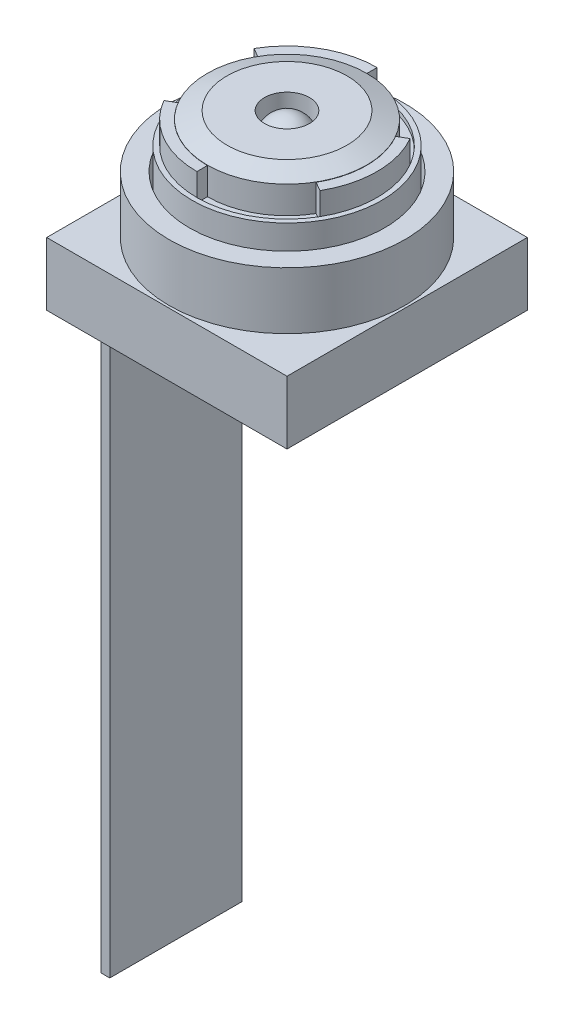
ISO-10303-21;
HEADER;
FILE_DESCRIPTION(('STEP AP214'),'2;1');
FILE_NAME('part.step','',(''),(''),'','','');
FILE_SCHEMA(('AUTOMOTIVE_DESIGN { 1 0 10303 214 1 1 1 1 }'));
ENDSEC;
DATA;
#1=APPLICATION_CONTEXT('core data for automotive mechanical design processes');
#2=APPLICATION_PROTOCOL_DEFINITION('international standard','automotive_design',2000,#1);
#3=PRODUCT_CONTEXT('',#1,'mechanical');
#4=PRODUCT('Part','Part','',(#3));
#5=PRODUCT_RELATED_PRODUCT_CATEGORY('part','',(#4));
#6=PRODUCT_DEFINITION_FORMATION('','',#4);
#7=PRODUCT_DEFINITION_CONTEXT('part definition',#1,'design');
#8=PRODUCT_DEFINITION('design','',#6,#7);
#9=PRODUCT_DEFINITION_SHAPE('','',#8);
#10=(LENGTH_UNIT() NAMED_UNIT(*) SI_UNIT(.MILLI.,.METRE.));
#11=(NAMED_UNIT(*) PLANE_ANGLE_UNIT() SI_UNIT($,.RADIAN.));
#12=(NAMED_UNIT(*) SI_UNIT($,.STERADIAN.) SOLID_ANGLE_UNIT());
#13=UNCERTAINTY_MEASURE_WITH_UNIT(LENGTH_MEASURE(1.E-05),#10,'distance_accuracy_value','');
#14=(GEOMETRIC_REPRESENTATION_CONTEXT(3) GLOBAL_UNCERTAINTY_ASSIGNED_CONTEXT((#13)) GLOBAL_UNIT_ASSIGNED_CONTEXT((#10,
#11,#12)) REPRESENTATION_CONTEXT('',''));
#15=CARTESIAN_POINT('',(0.,0.,0.));
#16=DIRECTION('',(0.,0.,1.));
#17=DIRECTION('',(1.,0.,0.));
#18=AXIS2_PLACEMENT_3D('',#15,#16,#17);
#19=CARTESIAN_POINT('',(18.,2.1,6.25));
#20=DIRECTION('',(0.,1.,0.));
#21=DIRECTION('',(0.,0.,1.));
#22=AXIS2_PLACEMENT_3D('',#19,#20,#21);
#23=PLANE('',#22);
#24=CARTESIAN_POINT('',(18.,2.1,6.25));
#25=DIRECTION('',(0.,1.,0.));
#26=DIRECTION('',(0.,0.,1.));
#27=AXIS2_PLACEMENT_3D('',#24,#25,#26);
#28=CIRCLE('',#27,0.750000000000001);
#29=CARTESIAN_POINT('',(18.,2.1,7.));
#30=VERTEX_POINT('',#29);
#31=EDGE_CURVE('P0_E20',#30,#30,#28,.T.);
#32=ORIENTED_EDGE('',*,*,#31,.T.);
#33=EDGE_LOOP('',(#32));
#34=FACE_BOUND('',#33,.T.);
#35=ADVANCED_FACE('P0_F17',(#34),#23,.T.);
#36=CARTESIAN_POINT('',(18.,0.,6.25));
#37=DIRECTION('',(0.,1.,0.));
#38=DIRECTION('',(0.,0.,1.));
#39=AXIS2_PLACEMENT_3D('',#36,#37,#38);
#40=CYLINDRICAL_SURFACE('',#39,0.750000000000001);
#41=ORIENTED_EDGE('',*,*,#31,.F.);
#42=EDGE_LOOP('',(#41));
#43=FACE_BOUND('',#42,.T.);
#44=CARTESIAN_POINT('',(18.,5.76,6.25));
#45=DIRECTION('',(0.,1.,0.));
#46=DIRECTION('',(0.,0.,1.));
#47=AXIS2_PLACEMENT_3D('',#44,#45,#46);
#48=CIRCLE('',#47,0.750000000000001);
#49=CARTESIAN_POINT('',(18.,5.76,7.));
#50=VERTEX_POINT('',#49);
#51=EDGE_CURVE('P0_E270',#50,#50,#48,.F.);
#52=ORIENTED_EDGE('',*,*,#51,.F.);
#53=EDGE_LOOP('',(#52));
#54=FACE_BOUND('',#53,.T.);
#55=ADVANCED_FACE('P0_F278',(#43,#54),#40,.F.);
#56=CARTESIAN_POINT('',(18.,5.76,6.25));
#57=DIRECTION('',(0.,1.,0.));
#58=DIRECTION('',(0.,0.,1.));
#59=AXIS2_PLACEMENT_3D('',#56,#57,#58);
#60=PLANE('',#59);
#61=ORIENTED_EDGE('',*,*,#51,.T.);
#62=EDGE_LOOP('',(#61));
#63=FACE_BOUND('',#62,.T.);
#64=CARTESIAN_POINT('',(18.,5.76000000002243,6.25));
#65=DIRECTION('',(0.,-1.,0.));
#66=DIRECTION('',(0.,0.,-1.));
#67=AXIS2_PLACEMENT_3D('',#64,#65,#66);
#68=CIRCLE('',#67,1.99999999998181);
#69=CARTESIAN_POINT('',(18.,5.76000000002243,4.25000000001819));
#70=VERTEX_POINT('',#69);
#71=EDGE_CURVE('P0_E190',#70,#70,#68,.T.);
#72=ORIENTED_EDGE('',*,*,#71,.F.);
#73=EDGE_LOOP('',(#72));
#74=FACE_BOUND('',#73,.T.);
#75=ADVANCED_FACE('P0_F281',(#63,#74),#60,.T.);
#76=CARTESIAN_POINT('',(18.,5.51000000004365,6.25));
#77=DIRECTION('',(0.,-1.,0.));
#78=DIRECTION('',(0.,0.,-1.));
#79=AXIS2_PLACEMENT_3D('',#76,#77,#78);
#80=CONICAL_SURFACE('',#79,2.64999999993233,1.20362249297961);
#81=CARTESIAN_POINT('',(18.,5.51,6.25));
#82=DIRECTION('',(0.,1.,0.));
#83=DIRECTION('',(0.,0.,1.));
#84=AXIS2_PLACEMENT_3D('',#81,#82,#83);
#85=CIRCLE('',#84,2.65);
#86=CARTESIAN_POINT('',(18.,5.51,8.9));
#87=VERTEX_POINT('',#86);
#88=EDGE_CURVE('P0_E156',#87,#87,#85,.F.);
#89=ORIENTED_EDGE('',*,*,#88,.F.);
#90=EDGE_LOOP('',(#89));
#91=FACE_BOUND('',#90,.T.);
#92=ORIENTED_EDGE('',*,*,#71,.T.);
#93=EDGE_LOOP('',(#92));
#94=FACE_BOUND('',#93,.T.);
#95=ADVANCED_FACE('P0_F287',(#91,#94),#80,.T.);
#96=CARTESIAN_POINT('',(18.,0.,6.25));
#97=DIRECTION('',(0.,1.,0.));
#98=DIRECTION('',(0.,0.,1.));
#99=AXIS2_PLACEMENT_3D('',#96,#97,#98);
#100=CYLINDRICAL_SURFACE('',#99,2.65);
#101=CARTESIAN_POINT('',(18.,4.6,6.25));
#102=DIRECTION('',(0.,1.,0.));
#103=DIRECTION('',(0.,0.,1.));
#104=AXIS2_PLACEMENT_3D('',#101,#102,#103);
#105=CIRCLE('',#104,2.65);
#106=CARTESIAN_POINT('',(15.7050326799712,4.6,7.57499999999998));
#107=VERTEX_POINT('',#106);
#108=CARTESIAN_POINT('',(15.7050326799712,4.6,4.92499999999999));
#109=VERTEX_POINT('',#108);
#110=EDGE_CURVE('P0_E143',#107,#109,#105,.F.);
#111=ORIENTED_EDGE('',*,*,#110,.F.);
#112=DIRECTION('',(0.,1.,0.));
#113=VECTOR('',#112,1.);
#114=CARTESIAN_POINT('',(15.7050326799712,0.,7.57499999999998));
#115=LINE('',#114,#113);
#116=CARTESIAN_POINT('',(15.7050326799712,5.5,7.57499999999998));
#117=VERTEX_POINT('',#116);
#118=EDGE_CURVE('P0_E148',#107,#117,#115,.T.);
#119=ORIENTED_EDGE('',*,*,#118,.T.);
#120=CARTESIAN_POINT('',(18.,5.5,6.25));
#121=DIRECTION('',(0.,1.,0.));
#122=DIRECTION('',(0.,0.,1.));
#123=AXIS2_PLACEMENT_3D('',#120,#121,#122);
#124=CIRCLE('',#123,2.65);
#125=CARTESIAN_POINT('',(18.,5.5,8.9));
#126=VERTEX_POINT('',#125);
#127=EDGE_CURVE('P0_E173',#126,#117,#124,.F.);
#128=ORIENTED_EDGE('',*,*,#127,.F.);
#129=DIRECTION('',(0.,1.,0.));
#130=VECTOR('',#129,1.);
#131=CARTESIAN_POINT('',(18.,0.,8.9));
#132=LINE('',#131,#130);
#133=CARTESIAN_POINT('',(18.,4.6,8.9));
#134=VERTEX_POINT('',#133);
#135=EDGE_CURVE('P0_E182',#134,#126,#132,.T.);
#136=ORIENTED_EDGE('',*,*,#135,.F.);
#137=CARTESIAN_POINT('',(18.,4.6,6.25));
#138=DIRECTION('',(0.,1.,0.));
#139=DIRECTION('',(0.,0.,1.));
#140=AXIS2_PLACEMENT_3D('',#137,#138,#139);
#141=CIRCLE('',#140,2.65);
#142=CARTESIAN_POINT('',(20.2949673200288,4.6,7.57499999999999));
#143=VERTEX_POINT('',#142);
#144=EDGE_CURVE('P0_E258',#143,#134,#141,.F.);
#145=ORIENTED_EDGE('',*,*,#144,.F.);
#146=DIRECTION('',(0.,1.,0.));
#147=VECTOR('',#146,1.);
#148=CARTESIAN_POINT('',(20.2949673200288,0.,7.575));
#149=LINE('',#148,#147);
#150=CARTESIAN_POINT('',(20.2949673200288,5.5,7.57499999999999));
#151=VERTEX_POINT('',#150);
#152=EDGE_CURVE('P0_E185',#151,#143,#149,.F.);
#153=ORIENTED_EDGE('',*,*,#152,.F.);
#154=CARTESIAN_POINT('',(18.,5.5,6.25));
#155=DIRECTION('',(0.,1.,0.));
#156=DIRECTION('',(0.,0.,1.));
#157=AXIS2_PLACEMENT_3D('',#154,#155,#156);
#158=CIRCLE('',#157,2.65);
#159=CARTESIAN_POINT('',(20.2949673200288,5.5,4.92500000000001));
#160=VERTEX_POINT('',#159);
#161=EDGE_CURVE('P0_E260',#160,#151,#158,.F.);
#162=ORIENTED_EDGE('',*,*,#161,.F.);
#163=DIRECTION('',(0.,1.,0.));
#164=VECTOR('',#163,1.);
#165=CARTESIAN_POINT('',(20.2949673200288,0.,4.92500000000001));
#166=LINE('',#165,#164);
#167=CARTESIAN_POINT('',(20.2949673200288,4.6,4.925));
#168=VERTEX_POINT('',#167);
#169=EDGE_CURVE('P0_E168',#160,#168,#166,.F.);
#170=ORIENTED_EDGE('',*,*,#169,.T.);
#171=CARTESIAN_POINT('',(18.,4.6,6.25));
#172=DIRECTION('',(0.,1.,0.));
#173=DIRECTION('',(0.,0.,1.));
#174=AXIS2_PLACEMENT_3D('',#171,#172,#173);
#175=CIRCLE('',#174,2.65);
#176=CARTESIAN_POINT('',(18.,4.6,3.6));
#177=VERTEX_POINT('',#176);
#178=EDGE_CURVE('P0_E263',#177,#168,#175,.F.);
#179=ORIENTED_EDGE('',*,*,#178,.F.);
#180=DIRECTION('',(0.,1.,0.));
#181=VECTOR('',#180,1.);
#182=CARTESIAN_POINT('',(18.,0.,3.6));
#183=LINE('',#182,#181);
#184=CARTESIAN_POINT('',(18.,5.5,3.6));
#185=VERTEX_POINT('',#184);
#186=EDGE_CURVE('P0_E191',#185,#177,#183,.F.);
#187=ORIENTED_EDGE('',*,*,#186,.F.);
#188=CARTESIAN_POINT('',(18.,5.5,6.25));
#189=DIRECTION('',(0.,1.,0.));
#190=DIRECTION('',(0.,0.,1.));
#191=AXIS2_PLACEMENT_3D('',#188,#189,#190);
#192=CIRCLE('',#191,2.65);
#193=CARTESIAN_POINT('',(15.7050326799712,5.5,4.925));
#194=VERTEX_POINT('',#193);
#195=EDGE_CURVE('P0_E267',#194,#185,#192,.F.);
#196=ORIENTED_EDGE('',*,*,#195,.F.);
#197=DIRECTION('',(0.,1.,0.));
#198=VECTOR('',#197,1.);
#199=CARTESIAN_POINT('',(15.7050326799712,0.,4.92499999999998));
#200=LINE('',#199,#198);
#201=EDGE_CURVE('P0_E151',#109,#194,#200,.T.);
#202=ORIENTED_EDGE('',*,*,#201,.F.);
#203=EDGE_LOOP('',(#111,#119,#128,#136,#145,#153,#162,#170,#179,#187,#196,#202));
#204=FACE_BOUND('',#203,.T.);
#205=ORIENTED_EDGE('',*,*,#88,.T.);
#206=EDGE_LOOP('',(#205));
#207=FACE_BOUND('',#206,.T.);
#208=ADVANCED_FACE('P0_F145',(#204,#207),#100,.T.);
#209=CARTESIAN_POINT('',(15.3525163399856,4.6,6.25));
#210=DIRECTION('',(0.,1.,0.));
#211=DIRECTION('',(0.,0.,1.));
#212=AXIS2_PLACEMENT_3D('',#209,#210,#211);
#213=PLANE('',#212);
#214=DIRECTION('',(-0.866025403784439,0.,0.5));
#215=VECTOR('',#214,1.);
#216=CARTESIAN_POINT('',(15.7050326799712,4.6,7.575));
#217=LINE('',#216,#215);
#218=CARTESIAN_POINT('',(15.4019237886467,4.6,7.74999999999999));
#219=VERTEX_POINT('',#218);
#220=EDGE_CURVE('P0_E163',#107,#219,#217,.T.);
#221=ORIENTED_EDGE('',*,*,#220,.F.);
#222=ORIENTED_EDGE('',*,*,#110,.T.);
#223=DIRECTION('',(0.866025403784439,0.,0.5));
#224=VECTOR('',#223,1.);
#225=CARTESIAN_POINT('',(15.4019237886467,4.6,4.75));
#226=LINE('',#225,#224);
#227=CARTESIAN_POINT('',(15.4019237886467,4.6,4.74999999999999));
#228=VERTEX_POINT('',#227);
#229=EDGE_CURVE('P0_E155',#228,#109,#226,.T.);
#230=ORIENTED_EDGE('',*,*,#229,.F.);
#231=CARTESIAN_POINT('',(18.,4.6,6.25));
#232=DIRECTION('',(0.,1.,0.));
#233=DIRECTION('',(0.,0.,1.));
#234=AXIS2_PLACEMENT_3D('',#231,#232,#233);
#235=CIRCLE('',#234,3.);
#236=EDGE_CURVE('P0_E172',#228,#219,#235,.T.);
#237=ORIENTED_EDGE('',*,*,#236,.T.);
#238=EDGE_LOOP('',(#221,#222,#230,#237));
#239=FACE_BOUND('',#238,.T.);
#240=ADVANCED_FACE('P0_F170',(#239),#213,.T.);
#241=CARTESIAN_POINT('',(15.4019237886467,0.,4.75));
#242=DIRECTION('',(-0.5,0.,0.866025403784439));
#243=DIRECTION('',(0.866025403784439,0.,0.5));
#244=AXIS2_PLACEMENT_3D('',#241,#242,#243);
#245=PLANE('',#244);
#246=DIRECTION('',(0.,1.,0.));
#247=VECTOR('',#246,1.);
#248=CARTESIAN_POINT('',(15.4019237886467,0.,4.74999999999999));
#249=LINE('',#248,#247);
#250=CARTESIAN_POINT('',(15.4019237886467,4.75,4.74999999999999));
#251=VERTEX_POINT('',#250);
#252=CARTESIAN_POINT('',(15.4019237886467,5.5,4.74999999999999));
#253=VERTEX_POINT('',#252);
#254=EDGE_CURVE('P0_E255',#251,#253,#249,.T.);
#255=ORIENTED_EDGE('',*,*,#254,.F.);
#256=DIRECTION('',(0.,1.,0.));
#257=VECTOR('',#256,1.);
#258=CARTESIAN_POINT('',(15.4019237886467,0.,4.74999999999999));
#259=LINE('',#258,#257);
#260=EDGE_CURVE('P0_E256',#251,#228,#259,.F.);
#261=ORIENTED_EDGE('',*,*,#260,.T.);
#262=ORIENTED_EDGE('',*,*,#229,.T.);
#263=ORIENTED_EDGE('',*,*,#201,.T.);
#264=DIRECTION('',(0.866025403784402,0.,0.500000000000063));
#265=VECTOR('',#264,1.);
#266=CARTESIAN_POINT('',(15.4019237886467,5.5,4.75));
#267=LINE('',#266,#265);
#268=EDGE_CURVE('P0_E196',#253,#194,#267,.T.);
#269=ORIENTED_EDGE('',*,*,#268,.F.);
#270=EDGE_LOOP('',(#255,#261,#262,#263,#269));
#271=FACE_BOUND('',#270,.T.);
#272=ADVANCED_FACE('P0_F401',(#271),#245,.T.);
#273=CARTESIAN_POINT('',(16.7009618943233,5.5,4.0875));
#274=DIRECTION('',(0.,1.,0.));
#275=DIRECTION('',(0.,0.,1.));
#276=AXIS2_PLACEMENT_3D('',#273,#274,#275);
#277=PLANE('',#276);
#278=ORIENTED_EDGE('',*,*,#195,.T.);
#279=DIRECTION('',(0.,0.,-1.));
#280=VECTOR('',#279,1.);
#281=CARTESIAN_POINT('',(18.,5.5,3.6));
#282=LINE('',#281,#280);
#283=CARTESIAN_POINT('',(18.,5.5,3.25));
#284=VERTEX_POINT('',#283);
#285=EDGE_CURVE('P0_E194',#284,#185,#282,.F.);
#286=ORIENTED_EDGE('',*,*,#285,.F.);
#287=CARTESIAN_POINT('',(18.,5.5,6.25));
#288=DIRECTION('',(0.,1.,0.));
#289=DIRECTION('',(0.,0.,1.));
#290=AXIS2_PLACEMENT_3D('',#287,#288,#289);
#291=CIRCLE('',#290,3.);
#292=EDGE_CURVE('P0_E252',#253,#284,#291,.F.);
#293=ORIENTED_EDGE('',*,*,#292,.F.);
#294=ORIENTED_EDGE('',*,*,#268,.T.);
#295=EDGE_LOOP('',(#278,#286,#293,#294));
#296=FACE_BOUND('',#295,.T.);
#297=ADVANCED_FACE('P0_F397',(#296),#277,.T.);
#298=CARTESIAN_POINT('',(18.,0.,3.6));
#299=DIRECTION('',(1.,0.,0.));
#300=DIRECTION('',(0.,0.,-1.));
#301=AXIS2_PLACEMENT_3D('',#298,#299,#300);
#302=PLANE('',#301);
#303=ORIENTED_EDGE('',*,*,#285,.T.);
#304=ORIENTED_EDGE('',*,*,#186,.T.);
#305=DIRECTION('',(0.,0.,1.));
#306=VECTOR('',#305,1.);
#307=CARTESIAN_POINT('',(18.,4.6,4.0875));
#308=LINE('',#307,#306);
#309=CARTESIAN_POINT('',(18.,4.6,3.25));
#310=VERTEX_POINT('',#309);
#311=EDGE_CURVE('P0_E193',#310,#177,#308,.T.);
#312=ORIENTED_EDGE('',*,*,#311,.F.);
#313=DIRECTION('',(0.,1.,0.));
#314=VECTOR('',#313,1.);
#315=CARTESIAN_POINT('',(18.,0.,3.25));
#316=LINE('',#315,#314);
#317=CARTESIAN_POINT('',(18.,4.75,3.25));
#318=VERTEX_POINT('',#317);
#319=EDGE_CURVE('P0_E642',#310,#318,#316,.T.);
#320=ORIENTED_EDGE('',*,*,#319,.T.);
#321=DIRECTION('',(0.,1.,0.));
#322=VECTOR('',#321,1.);
#323=CARTESIAN_POINT('',(18.,0.,3.25));
#324=LINE('',#323,#322);
#325=EDGE_CURVE('P0_E254',#284,#318,#324,.F.);
#326=ORIENTED_EDGE('',*,*,#325,.F.);
#327=EDGE_LOOP('',(#303,#304,#312,#320,#326));
#328=FACE_BOUND('',#327,.T.);
#329=ADVANCED_FACE('P0_F393',(#328),#302,.T.);
#330=CARTESIAN_POINT('',(19.2990381056767,4.6,4.0875));
#331=DIRECTION('',(0.,1.,0.));
#332=DIRECTION('',(0.,0.,1.));
#333=AXIS2_PLACEMENT_3D('',#330,#331,#332);
#334=PLANE('',#333);
#335=ORIENTED_EDGE('',*,*,#311,.T.);
#336=ORIENTED_EDGE('',*,*,#178,.T.);
#337=DIRECTION('',(-0.866025403784439,0.,0.5));
#338=VECTOR('',#337,1.);
#339=CARTESIAN_POINT('',(20.5980762113533,4.6,4.75));
#340=LINE('',#339,#338);
#341=CARTESIAN_POINT('',(20.5980762113533,4.6,4.74999999999999));
#342=VERTEX_POINT('',#341);
#343=EDGE_CURVE('P0_E266',#342,#168,#340,.T.);
#344=ORIENTED_EDGE('',*,*,#343,.F.);
#345=CARTESIAN_POINT('',(18.,4.6,6.25));
#346=DIRECTION('',(0.,1.,0.));
#347=DIRECTION('',(0.,0.,1.));
#348=AXIS2_PLACEMENT_3D('',#345,#346,#347);
#349=CIRCLE('',#348,3.);
#350=EDGE_CURVE('P0_E248',#342,#310,#349,.T.);
#351=ORIENTED_EDGE('',*,*,#350,.T.);
#352=EDGE_LOOP('',(#335,#336,#344,#351));
#353=FACE_BOUND('',#352,.T.);
#354=ADVANCED_FACE('P0_F389',(#353),#334,.T.);
#355=CARTESIAN_POINT('',(20.5980762113533,0.,4.75));
#356=DIRECTION('',(-0.5,0.,-0.866025403784439));
#357=DIRECTION('',(-0.866025403784439,0.,0.5));
#358=AXIS2_PLACEMENT_3D('',#355,#356,#357);
#359=PLANE('',#358);
#360=DIRECTION('',(0.,1.,0.));
#361=VECTOR('',#360,1.);
#362=CARTESIAN_POINT('',(20.5980762113533,0.,4.74999999999999));
#363=LINE('',#362,#361);
#364=CARTESIAN_POINT('',(20.5980762113533,4.75,4.74999999999999));
#365=VERTEX_POINT('',#364);
#366=CARTESIAN_POINT('',(20.5980762113533,5.5,4.74999999999999));
#367=VERTEX_POINT('',#366);
#368=EDGE_CURVE('P0_E247',#365,#367,#363,.T.);
#369=ORIENTED_EDGE('',*,*,#368,.F.);
#370=DIRECTION('',(0.,1.,0.));
#371=VECTOR('',#370,1.);
#372=CARTESIAN_POINT('',(20.5980762113533,0.,4.74999999999999));
#373=LINE('',#372,#371);
#374=EDGE_CURVE('P0_E251',#365,#342,#373,.F.);
#375=ORIENTED_EDGE('',*,*,#374,.T.);
#376=ORIENTED_EDGE('',*,*,#343,.T.);
#377=ORIENTED_EDGE('',*,*,#169,.F.);
#378=DIRECTION('',(-0.866025403784401,0.,0.500000000000066));
#379=VECTOR('',#378,1.);
#380=CARTESIAN_POINT('',(20.5980762113533,5.5,4.75));
#381=LINE('',#380,#379);
#382=EDGE_CURVE('P0_E262',#367,#160,#381,.T.);
#383=ORIENTED_EDGE('',*,*,#382,.F.);
#384=EDGE_LOOP('',(#369,#375,#376,#377,#383));
#385=FACE_BOUND('',#384,.T.);
#386=ADVANCED_FACE('P0_F385',(#385),#359,.T.);
#387=CARTESIAN_POINT('',(20.6474836600144,5.5,6.25));
#388=DIRECTION('',(0.,1.,0.));
#389=DIRECTION('',(0.,0.,1.));
#390=AXIS2_PLACEMENT_3D('',#387,#388,#389);
#391=PLANE('',#390);
#392=ORIENTED_EDGE('',*,*,#161,.T.);
#393=DIRECTION('',(0.866025403784439,0.,0.5));
#394=VECTOR('',#393,1.);
#395=CARTESIAN_POINT('',(20.2949673200288,5.5,7.575));
#396=LINE('',#395,#394);
#397=CARTESIAN_POINT('',(20.5980762113533,5.5,7.75));
#398=VERTEX_POINT('',#397);
#399=EDGE_CURVE('P0_E188',#398,#151,#396,.F.);
#400=ORIENTED_EDGE('',*,*,#399,.F.);
#401=CARTESIAN_POINT('',(18.,5.5,6.25));
#402=DIRECTION('',(0.,1.,0.));
#403=DIRECTION('',(0.,0.,1.));
#404=AXIS2_PLACEMENT_3D('',#401,#402,#403);
#405=CIRCLE('',#404,3.);
#406=EDGE_CURVE('P0_E244',#367,#398,#405,.F.);
#407=ORIENTED_EDGE('',*,*,#406,.F.);
#408=ORIENTED_EDGE('',*,*,#382,.T.);
#409=EDGE_LOOP('',(#392,#400,#407,#408));
#410=FACE_BOUND('',#409,.T.);
#411=ADVANCED_FACE('P0_F381',(#410),#391,.T.);
#412=CARTESIAN_POINT('',(20.2949673200288,0.,7.575));
#413=DIRECTION('',(-0.5,0.,0.866025403784439));
#414=DIRECTION('',(0.866025403784439,0.,0.5));
#415=AXIS2_PLACEMENT_3D('',#412,#413,#414);
#416=PLANE('',#415);
#417=ORIENTED_EDGE('',*,*,#399,.T.);
#418=ORIENTED_EDGE('',*,*,#152,.T.);
#419=DIRECTION('',(-0.866025403784401,0.,-0.500000000000066));
#420=VECTOR('',#419,1.);
#421=CARTESIAN_POINT('',(20.5980762113533,4.6,7.75));
#422=LINE('',#421,#420);
#423=CARTESIAN_POINT('',(20.5980762113533,4.6,7.75000000000001));
#424=VERTEX_POINT('',#423);
#425=EDGE_CURVE('P0_E187',#424,#143,#422,.T.);
#426=ORIENTED_EDGE('',*,*,#425,.F.);
#427=DIRECTION('',(0.,1.,0.));
#428=VECTOR('',#427,1.);
#429=CARTESIAN_POINT('',(20.5980762113533,0.,7.75000000000001));
#430=LINE('',#429,#428);
#431=CARTESIAN_POINT('',(20.5980762113533,4.75,7.75000000000001));
#432=VERTEX_POINT('',#431);
#433=EDGE_CURVE('P0_E681',#424,#432,#430,.T.);
#434=ORIENTED_EDGE('',*,*,#433,.T.);
#435=DIRECTION('',(0.,1.,0.));
#436=VECTOR('',#435,1.);
#437=CARTESIAN_POINT('',(20.5980762113533,0.,7.75000000000001));
#438=LINE('',#437,#436);
#439=EDGE_CURVE('P0_E246',#398,#432,#438,.F.);
#440=ORIENTED_EDGE('',*,*,#439,.F.);
#441=EDGE_LOOP('',(#417,#418,#426,#434,#440));
#442=FACE_BOUND('',#441,.T.);
#443=ADVANCED_FACE('P0_F377',(#442),#416,.T.);
#444=CARTESIAN_POINT('',(19.2990381056767,4.6,8.4125));
#445=DIRECTION('',(0.,1.,0.));
#446=DIRECTION('',(0.,0.,1.));
#447=AXIS2_PLACEMENT_3D('',#444,#445,#446);
#448=PLANE('',#447);
#449=ORIENTED_EDGE('',*,*,#144,.T.);
#450=DIRECTION('',(0.,0.,-1.));
#451=VECTOR('',#450,1.);
#452=CARTESIAN_POINT('',(18.,4.6,9.25));
#453=LINE('',#452,#451);
#454=CARTESIAN_POINT('',(18.,4.6,9.25));
#455=VERTEX_POINT('',#454);
#456=EDGE_CURVE('P0_E184',#455,#134,#453,.T.);
#457=ORIENTED_EDGE('',*,*,#456,.F.);
#458=CARTESIAN_POINT('',(18.,4.6,6.25));
#459=DIRECTION('',(0.,1.,0.));
#460=DIRECTION('',(0.,0.,1.));
#461=AXIS2_PLACEMENT_3D('',#458,#459,#460);
#462=CIRCLE('',#461,3.);
#463=EDGE_CURVE('P0_E240',#455,#424,#462,.T.);
#464=ORIENTED_EDGE('',*,*,#463,.T.);
#465=ORIENTED_EDGE('',*,*,#425,.T.);
#466=EDGE_LOOP('',(#449,#457,#464,#465));
#467=FACE_BOUND('',#466,.T.);
#468=ADVANCED_FACE('P0_F373',(#467),#448,.T.);
#469=CARTESIAN_POINT('',(18.,0.,9.25));
#470=DIRECTION('',(1.,0.,0.));
#471=DIRECTION('',(0.,0.,-1.));
#472=AXIS2_PLACEMENT_3D('',#469,#470,#471);
#473=PLANE('',#472);
#474=DIRECTION('',(0.,1.,0.));
#475=VECTOR('',#474,1.);
#476=CARTESIAN_POINT('',(18.,0.,9.25));
#477=LINE('',#476,#475);
#478=CARTESIAN_POINT('',(18.,4.75,9.25));
#479=VERTEX_POINT('',#478);
#480=CARTESIAN_POINT('',(18.,5.5,9.25));
#481=VERTEX_POINT('',#480);
#482=EDGE_CURVE('P0_E239',#479,#481,#477,.T.);
#483=ORIENTED_EDGE('',*,*,#482,.F.);
#484=DIRECTION('',(0.,1.,0.));
#485=VECTOR('',#484,1.);
#486=CARTESIAN_POINT('',(18.,0.,9.25));
#487=LINE('',#486,#485);
#488=EDGE_CURVE('P0_E243',#479,#455,#487,.F.);
#489=ORIENTED_EDGE('',*,*,#488,.T.);
#490=ORIENTED_EDGE('',*,*,#456,.T.);
#491=ORIENTED_EDGE('',*,*,#135,.T.);
#492=DIRECTION('',(0.,0.,1.));
#493=VECTOR('',#492,1.);
#494=CARTESIAN_POINT('',(18.,5.5,8.4125));
#495=LINE('',#494,#493);
#496=EDGE_CURVE('P0_E177',#481,#126,#495,.F.);
#497=ORIENTED_EDGE('',*,*,#496,.F.);
#498=EDGE_LOOP('',(#483,#489,#490,#491,#497));
#499=FACE_BOUND('',#498,.T.);
#500=ADVANCED_FACE('P0_F369',(#499),#473,.T.);
#501=CARTESIAN_POINT('',(16.7009618943233,5.5,8.4125));
#502=DIRECTION('',(0.,1.,0.));
#503=DIRECTION('',(0.,0.,1.));
#504=AXIS2_PLACEMENT_3D('',#501,#502,#503);
#505=PLANE('',#504);
#506=ORIENTED_EDGE('',*,*,#127,.T.);
#507=DIRECTION('',(-0.866025403784439,0.,0.5));
#508=VECTOR('',#507,1.);
#509=CARTESIAN_POINT('',(15.7050326799712,5.5,7.575));
#510=LINE('',#509,#508);
#511=CARTESIAN_POINT('',(15.4019237886467,5.5,7.74999999999999));
#512=VERTEX_POINT('',#511);
#513=EDGE_CURVE('P0_E167',#512,#117,#510,.F.);
#514=ORIENTED_EDGE('',*,*,#513,.F.);
#515=CARTESIAN_POINT('',(18.,5.5,6.25));
#516=DIRECTION('',(0.,1.,0.));
#517=DIRECTION('',(0.,0.,1.));
#518=AXIS2_PLACEMENT_3D('',#515,#516,#517);
#519=CIRCLE('',#518,3.);
#520=EDGE_CURVE('P0_E237',#481,#512,#519,.F.);
#521=ORIENTED_EDGE('',*,*,#520,.F.);
#522=ORIENTED_EDGE('',*,*,#496,.T.);
#523=EDGE_LOOP('',(#506,#514,#521,#522));
#524=FACE_BOUND('',#523,.T.);
#525=ADVANCED_FACE('P0_F366',(#524),#505,.T.);
#526=CARTESIAN_POINT('',(15.7050326799712,0.,7.575));
#527=DIRECTION('',(-0.5,0.,-0.866025403784439));
#528=DIRECTION('',(-0.866025403784439,0.,0.5));
#529=AXIS2_PLACEMENT_3D('',#526,#527,#528);
#530=PLANE('',#529);
#531=ORIENTED_EDGE('',*,*,#513,.T.);
#532=ORIENTED_EDGE('',*,*,#118,.F.);
#533=ORIENTED_EDGE('',*,*,#220,.T.);
#534=DIRECTION('',(0.,1.,0.));
#535=VECTOR('',#534,1.);
#536=CARTESIAN_POINT('',(15.4019237886467,0.,7.75000000000001));
#537=LINE('',#536,#535);
#538=CARTESIAN_POINT('',(15.4019237886467,4.75,7.75000000000001));
#539=VERTEX_POINT('',#538);
#540=EDGE_CURVE('P0_E175',#219,#539,#537,.T.);
#541=ORIENTED_EDGE('',*,*,#540,.T.);
#542=DIRECTION('',(0.,1.,0.));
#543=VECTOR('',#542,1.);
#544=CARTESIAN_POINT('',(15.4019237886467,0.,7.75000000000001));
#545=LINE('',#544,#543);
#546=EDGE_CURVE('P0_E236',#512,#539,#545,.F.);
#547=ORIENTED_EDGE('',*,*,#546,.F.);
#548=EDGE_LOOP('',(#531,#532,#533,#541,#547));
#549=FACE_BOUND('',#548,.T.);
#550=ADVANCED_FACE('P0_F161',(#549),#530,.T.);
#551=CARTESIAN_POINT('',(18.,0.,6.25));
#552=DIRECTION('',(0.,1.,0.));
#553=DIRECTION('',(0.,0.,1.));
#554=AXIS2_PLACEMENT_3D('',#551,#552,#553);
#555=CYLINDRICAL_SURFACE('',#554,3.);
#556=ORIENTED_EDGE('',*,*,#236,.F.);
#557=ORIENTED_EDGE('',*,*,#260,.F.);
#558=CARTESIAN_POINT('',(18.,4.75,6.25));
#559=DIRECTION('',(0.,1.,0.));
#560=DIRECTION('',(0.,0.,1.));
#561=AXIS2_PLACEMENT_3D('',#558,#559,#560);
#562=CIRCLE('',#561,3.);
#563=EDGE_CURVE('P0_E233',#539,#251,#562,.F.);
#564=ORIENTED_EDGE('',*,*,#563,.F.);
#565=ORIENTED_EDGE('',*,*,#540,.F.);
#566=EDGE_LOOP('',(#556,#557,#564,#565));
#567=FACE_BOUND('',#566,.T.);
#568=ADVANCED_FACE('P0_F359',(#567),#555,.F.);
#569=CARTESIAN_POINT('',(18.,0.,6.25));
#570=DIRECTION('',(0.,1.,0.));
#571=DIRECTION('',(0.,0.,1.));
#572=AXIS2_PLACEMENT_3D('',#569,#570,#571);
#573=CYLINDRICAL_SURFACE('',#572,3.);
#574=ORIENTED_EDGE('',*,*,#292,.T.);
#575=ORIENTED_EDGE('',*,*,#325,.T.);
#576=CARTESIAN_POINT('',(18.,4.75,6.25));
#577=DIRECTION('',(0.,1.,0.));
#578=DIRECTION('',(0.,0.,1.));
#579=AXIS2_PLACEMENT_3D('',#576,#577,#578);
#580=CIRCLE('',#579,3.);
#581=EDGE_CURVE('P0_E230',#251,#318,#580,.F.);
#582=ORIENTED_EDGE('',*,*,#581,.F.);
#583=ORIENTED_EDGE('',*,*,#254,.T.);
#584=EDGE_LOOP('',(#574,#575,#582,#583));
#585=FACE_BOUND('',#584,.T.);
#586=ADVANCED_FACE('P0_F355',(#585),#573,.T.);
#587=CARTESIAN_POINT('',(18.,0.,6.25));
#588=DIRECTION('',(0.,1.,0.));
#589=DIRECTION('',(0.,0.,1.));
#590=AXIS2_PLACEMENT_3D('',#587,#588,#589);
#591=CYLINDRICAL_SURFACE('',#590,3.);
#592=ORIENTED_EDGE('',*,*,#374,.F.);
#593=CARTESIAN_POINT('',(18.,4.75,6.25));
#594=DIRECTION('',(0.,1.,0.));
#595=DIRECTION('',(0.,0.,1.));
#596=AXIS2_PLACEMENT_3D('',#593,#594,#595);
#597=CIRCLE('',#596,3.);
#598=EDGE_CURVE('P0_E227',#318,#365,#597,.F.);
#599=ORIENTED_EDGE('',*,*,#598,.F.);
#600=ORIENTED_EDGE('',*,*,#319,.F.);
#601=ORIENTED_EDGE('',*,*,#350,.F.);
#602=EDGE_LOOP('',(#592,#599,#600,#601));
#603=FACE_BOUND('',#602,.T.);
#604=ADVANCED_FACE('P0_F351',(#603),#591,.F.);
#605=CARTESIAN_POINT('',(18.,0.,6.25));
#606=DIRECTION('',(0.,1.,0.));
#607=DIRECTION('',(0.,0.,1.));
#608=AXIS2_PLACEMENT_3D('',#605,#606,#607);
#609=CYLINDRICAL_SURFACE('',#608,3.);
#610=ORIENTED_EDGE('',*,*,#406,.T.);
#611=ORIENTED_EDGE('',*,*,#439,.T.);
#612=CARTESIAN_POINT('',(18.,4.75,6.25));
#613=DIRECTION('',(0.,1.,0.));
#614=DIRECTION('',(0.,0.,1.));
#615=AXIS2_PLACEMENT_3D('',#612,#613,#614);
#616=CIRCLE('',#615,3.);
#617=EDGE_CURVE('P0_E224',#365,#432,#616,.F.);
#618=ORIENTED_EDGE('',*,*,#617,.F.);
#619=ORIENTED_EDGE('',*,*,#368,.T.);
#620=EDGE_LOOP('',(#610,#611,#618,#619));
#621=FACE_BOUND('',#620,.T.);
#622=ADVANCED_FACE('P0_F347',(#621),#609,.T.);
#623=CARTESIAN_POINT('',(18.,0.,6.25));
#624=DIRECTION('',(0.,1.,0.));
#625=DIRECTION('',(0.,0.,1.));
#626=AXIS2_PLACEMENT_3D('',#623,#624,#625);
#627=CYLINDRICAL_SURFACE('',#626,3.);
#628=ORIENTED_EDGE('',*,*,#488,.F.);
#629=CARTESIAN_POINT('',(18.,4.75,6.25));
#630=DIRECTION('',(0.,1.,0.));
#631=DIRECTION('',(0.,0.,1.));
#632=AXIS2_PLACEMENT_3D('',#629,#630,#631);
#633=CIRCLE('',#632,3.);
#634=EDGE_CURVE('P0_E221',#432,#479,#633,.F.);
#635=ORIENTED_EDGE('',*,*,#634,.F.);
#636=ORIENTED_EDGE('',*,*,#433,.F.);
#637=ORIENTED_EDGE('',*,*,#463,.F.);
#638=EDGE_LOOP('',(#628,#635,#636,#637));
#639=FACE_BOUND('',#638,.T.);
#640=ADVANCED_FACE('P0_F343',(#639),#627,.F.);
#641=CARTESIAN_POINT('',(18.,0.,6.25));
#642=DIRECTION('',(0.,1.,0.));
#643=DIRECTION('',(0.,0.,1.));
#644=AXIS2_PLACEMENT_3D('',#641,#642,#643);
#645=CYLINDRICAL_SURFACE('',#644,3.);
#646=ORIENTED_EDGE('',*,*,#520,.T.);
#647=ORIENTED_EDGE('',*,*,#546,.T.);
#648=CARTESIAN_POINT('',(18.,4.75,6.25));
#649=DIRECTION('',(0.,1.,0.));
#650=DIRECTION('',(0.,0.,1.));
#651=AXIS2_PLACEMENT_3D('',#648,#649,#650);
#652=CIRCLE('',#651,3.);
#653=EDGE_CURVE('P0_E218',#479,#539,#652,.F.);
#654=ORIENTED_EDGE('',*,*,#653,.F.);
#655=ORIENTED_EDGE('',*,*,#482,.T.);
#656=EDGE_LOOP('',(#646,#647,#654,#655));
#657=FACE_BOUND('',#656,.T.);
#658=ADVANCED_FACE('P0_F339',(#657),#645,.T.);
#659=CARTESIAN_POINT('',(18.,4.75,6.25));
#660=DIRECTION('',(0.,1.,0.));
#661=DIRECTION('',(0.,0.,1.));
#662=AXIS2_PLACEMENT_3D('',#659,#660,#661);
#663=PLANE('',#662);
#664=ORIENTED_EDGE('',*,*,#634,.T.);
#665=ORIENTED_EDGE('',*,*,#653,.T.);
#666=ORIENTED_EDGE('',*,*,#563,.T.);
#667=ORIENTED_EDGE('',*,*,#581,.T.);
#668=ORIENTED_EDGE('',*,*,#598,.T.);
#669=ORIENTED_EDGE('',*,*,#617,.T.);
#670=EDGE_LOOP('',(#664,#665,#666,#667,#668,#669));
#671=FACE_BOUND('',#670,.T.);
#672=CARTESIAN_POINT('',(18.,4.75,6.25));
#673=DIRECTION('',(0.,1.,0.));
#674=DIRECTION('',(0.,0.,1.));
#675=AXIS2_PLACEMENT_3D('',#672,#673,#674);
#676=CIRCLE('',#675,3.16);
#677=CARTESIAN_POINT('',(18.,4.75,9.41));
#678=VERTEX_POINT('',#677);
#679=EDGE_CURVE('P0_E215',#678,#678,#676,.F.);
#680=ORIENTED_EDGE('',*,*,#679,.F.);
#681=EDGE_LOOP('',(#680));
#682=FACE_BOUND('',#681,.T.);
#683=ADVANCED_FACE('P0_F335',(#671,#682),#663,.T.);
#684=CARTESIAN_POINT('',(18.,0.,6.25));
#685=DIRECTION('',(0.,1.,0.));
#686=DIRECTION('',(0.,0.,1.));
#687=AXIS2_PLACEMENT_3D('',#684,#685,#686);
#688=CYLINDRICAL_SURFACE('',#687,3.16);
#689=ORIENTED_EDGE('',*,*,#679,.T.);
#690=EDGE_LOOP('',(#689));
#691=FACE_BOUND('',#690,.T.);
#692=CARTESIAN_POINT('',(18.,2.1,6.25));
#693=DIRECTION('',(0.,1.,0.));
#694=DIRECTION('',(0.,0.,1.));
#695=AXIS2_PLACEMENT_3D('',#692,#693,#694);
#696=CIRCLE('',#695,3.16);
#697=CARTESIAN_POINT('',(18.,2.1,9.41));
#698=VERTEX_POINT('',#697);
#699=EDGE_CURVE('P0_E212',#698,#698,#696,.F.);
#700=ORIENTED_EDGE('',*,*,#699,.F.);
#701=EDGE_LOOP('',(#700));
#702=FACE_BOUND('',#701,.T.);
#703=ADVANCED_FACE('P0_F331',(#691,#702),#688,.T.);
#704=CARTESIAN_POINT('',(18.,2.1,6.25));
#705=DIRECTION('',(0.,1.,0.));
#706=DIRECTION('',(0.,0.,1.));
#707=AXIS2_PLACEMENT_3D('',#704,#705,#706);
#708=PLANE('',#707);
#709=ORIENTED_EDGE('',*,*,#699,.T.);
#710=EDGE_LOOP('',(#709));
#711=FACE_BOUND('',#710,.T.);
#712=CARTESIAN_POINT('',(18.,2.1,6.25));
#713=DIRECTION('',(0.,1.,0.));
#714=DIRECTION('',(0.,0.,1.));
#715=AXIS2_PLACEMENT_3D('',#712,#713,#714);
#716=CIRCLE('',#715,3.25);
#717=CARTESIAN_POINT('',(18.,2.1,9.5));
#718=VERTEX_POINT('',#717);
#719=EDGE_CURVE('P0_E209',#718,#718,#716,.T.);
#720=ORIENTED_EDGE('',*,*,#719,.T.);
#721=EDGE_LOOP('',(#720));
#722=FACE_BOUND('',#721,.T.);
#723=ADVANCED_FACE('P0_F327',(#711,#722),#708,.T.);
#724=CARTESIAN_POINT('',(18.,0.,6.25));
#725=DIRECTION('',(0.,1.,0.));
#726=DIRECTION('',(0.,0.,1.));
#727=AXIS2_PLACEMENT_3D('',#724,#725,#726);
#728=CYLINDRICAL_SURFACE('',#727,3.25);
#729=ORIENTED_EDGE('',*,*,#719,.F.);
#730=EDGE_LOOP('',(#729));
#731=FACE_BOUND('',#730,.T.);
#732=CARTESIAN_POINT('',(18.,4.,6.25));
#733=DIRECTION('',(0.,1.,0.));
#734=DIRECTION('',(0.,0.,1.));
#735=AXIS2_PLACEMENT_3D('',#732,#733,#734);
#736=CIRCLE('',#735,3.25);
#737=CARTESIAN_POINT('',(18.,4.,9.5));
#738=VERTEX_POINT('',#737);
#739=EDGE_CURVE('P0_E206',#738,#738,#736,.F.);
#740=ORIENTED_EDGE('',*,*,#739,.F.);
#741=EDGE_LOOP('',(#740));
#742=FACE_BOUND('',#741,.T.);
#743=ADVANCED_FACE('P0_F323',(#731,#742),#728,.F.);
#744=CARTESIAN_POINT('',(18.,4.,6.25));
#745=DIRECTION('',(0.,1.,0.));
#746=DIRECTION('',(0.,0.,1.));
#747=AXIS2_PLACEMENT_3D('',#744,#745,#746);
#748=PLANE('',#747);
#749=ORIENTED_EDGE('',*,*,#739,.T.);
#750=EDGE_LOOP('',(#749));
#751=FACE_BOUND('',#750,.T.);
#752=CARTESIAN_POINT('',(18.,4.,6.25));
#753=DIRECTION('',(0.,1.,0.));
#754=DIRECTION('',(0.,0.,1.));
#755=AXIS2_PLACEMENT_3D('',#752,#753,#754);
#756=CIRCLE('',#755,3.925);
#757=CARTESIAN_POINT('',(18.,4.,10.175));
#758=VERTEX_POINT('',#757);
#759=EDGE_CURVE('P0_E203',#758,#758,#756,.F.);
#760=ORIENTED_EDGE('',*,*,#759,.F.);
#761=EDGE_LOOP('',(#760));
#762=FACE_BOUND('',#761,.T.);
#763=ADVANCED_FACE('P0_F319',(#751,#762),#748,.T.);
#764=CARTESIAN_POINT('',(18.,0.,6.25));
#765=DIRECTION('',(0.,1.,0.));
#766=DIRECTION('',(0.,0.,1.));
#767=AXIS2_PLACEMENT_3D('',#764,#765,#766);
#768=CYLINDRICAL_SURFACE('',#767,3.925);
#769=ORIENTED_EDGE('',*,*,#759,.T.);
#770=EDGE_LOOP('',(#769));
#771=FACE_BOUND('',#770,.T.);
#772=CARTESIAN_POINT('',(18.,2.1,6.25));
#773=DIRECTION('',(0.,1.,0.));
#774=DIRECTION('',(0.,0.,1.));
#775=AXIS2_PLACEMENT_3D('',#772,#773,#774);
#776=CIRCLE('',#775,3.925);
#777=CARTESIAN_POINT('',(18.,2.1,10.175));
#778=VERTEX_POINT('',#777);
#779=EDGE_CURVE('P0_E199',#778,#778,#776,.F.);
#780=ORIENTED_EDGE('',*,*,#779,.F.);
#781=EDGE_LOOP('',(#780));
#782=FACE_BOUND('',#781,.T.);
#783=ADVANCED_FACE('P0_F315',(#771,#782),#768,.T.);
#784=CARTESIAN_POINT('',(18.,2.1,6.25));
#785=DIRECTION('',(0.,1.,0.));
#786=DIRECTION('',(0.,0.,1.));
#787=AXIS2_PLACEMENT_3D('',#784,#785,#786);
#788=PLANE('',#787);
#789=ORIENTED_EDGE('',*,*,#779,.T.);
#790=EDGE_LOOP('',(#789));
#791=FACE_BOUND('',#790,.T.);
#792=DIRECTION('',(-1.,0.,0.));
#793=VECTOR('',#792,1.);
#794=CARTESIAN_POINT('',(22.,2.1,2.25));
#795=LINE('',#794,#793);
#796=CARTESIAN_POINT('',(14.,2.1,2.25));
#797=VERTEX_POINT('',#796);
#798=CARTESIAN_POINT('',(22.,2.1,2.25));
#799=VERTEX_POINT('',#798);
#800=EDGE_CURVE('P0_E690',#797,#799,#795,.F.);
#801=ORIENTED_EDGE('',*,*,#800,.F.);
#802=DIRECTION('',(0.,0.,1.));
#803=VECTOR('',#802,1.);
#804=CARTESIAN_POINT('',(14.,2.1,2.25));
#805=LINE('',#804,#803);
#806=CARTESIAN_POINT('',(14.,2.1,10.25));
#807=VERTEX_POINT('',#806);
#808=EDGE_CURVE('P0_E694',#807,#797,#805,.F.);
#809=ORIENTED_EDGE('',*,*,#808,.F.);
#810=DIRECTION('',(1.,0.,0.));
#811=VECTOR('',#810,1.);
#812=CARTESIAN_POINT('',(14.,2.1,10.25));
#813=LINE('',#812,#811);
#814=CARTESIAN_POINT('',(22.,2.1,10.25));
#815=VERTEX_POINT('',#814);
#816=EDGE_CURVE('P0_E701',#815,#807,#813,.F.);
#817=ORIENTED_EDGE('',*,*,#816,.F.);
#818=DIRECTION('',(0.,0.,-1.));
#819=VECTOR('',#818,1.);
#820=CARTESIAN_POINT('',(22.,2.1,10.25));
#821=LINE('',#820,#819);
#822=EDGE_CURVE('P0_E202',#799,#815,#821,.F.);
#823=ORIENTED_EDGE('',*,*,#822,.F.);
#824=EDGE_LOOP('',(#801,#809,#817,#823));
#825=FACE_BOUND('',#824,.T.);
#826=ADVANCED_FACE('P0_F311',(#791,#825),#788,.T.);
#827=CARTESIAN_POINT('',(22.,0.,10.25));
#828=DIRECTION('',(1.,0.,0.));
#829=DIRECTION('',(0.,0.,-1.));
#830=AXIS2_PLACEMENT_3D('',#827,#828,#829);
#831=PLANE('',#830);
#832=ORIENTED_EDGE('',*,*,#822,.T.);
#833=DIRECTION('',(0.,1.,0.));
#834=VECTOR('',#833,1.);
#835=CARTESIAN_POINT('',(22.,0.,10.25));
#836=LINE('',#835,#834);
#837=CARTESIAN_POINT('',(22.,0.,10.25));
#838=VERTEX_POINT('',#837);
#839=EDGE_CURVE('P0_E698',#838,#815,#836,.T.);
#840=ORIENTED_EDGE('',*,*,#839,.F.);
#841=DIRECTION('',(0.,0.,1.));
#842=VECTOR('',#841,1.);
#843=CARTESIAN_POINT('',(22.,0.,6.25));
#844=LINE('',#843,#842);
#845=CARTESIAN_POINT('',(22.,0.,2.25));
#846=VERTEX_POINT('',#845);
#847=EDGE_CURVE('P0_E704',#838,#846,#844,.F.);
#848=ORIENTED_EDGE('',*,*,#847,.T.);
#849=DIRECTION('',(0.,1.,0.));
#850=VECTOR('',#849,1.);
#851=CARTESIAN_POINT('',(22.,0.,2.25));
#852=LINE('',#851,#850);
#853=EDGE_CURVE('P0_E692',#799,#846,#852,.F.);
#854=ORIENTED_EDGE('',*,*,#853,.F.);
#855=EDGE_LOOP('',(#832,#840,#848,#854));
#856=FACE_BOUND('',#855,.T.);
#857=ADVANCED_FACE('P0_F307',(#856),#831,.T.);
#858=CARTESIAN_POINT('',(22.,0.,2.25));
#859=DIRECTION('',(0.,0.,-1.));
#860=DIRECTION('',(-1.,0.,0.));
#861=AXIS2_PLACEMENT_3D('',#858,#859,#860);
#862=PLANE('',#861);
#863=ORIENTED_EDGE('',*,*,#800,.T.);
#864=ORIENTED_EDGE('',*,*,#853,.T.);
#865=DIRECTION('',(1.,0.,0.));
#866=VECTOR('',#865,1.);
#867=CARTESIAN_POINT('',(18.,0.,2.25));
#868=LINE('',#867,#866);
#869=CARTESIAN_POINT('',(14.,0.,2.25));
#870=VERTEX_POINT('',#869);
#871=EDGE_CURVE('P0_E707',#846,#870,#868,.F.);
#872=ORIENTED_EDGE('',*,*,#871,.T.);
#873=DIRECTION('',(0.,1.,0.));
#874=VECTOR('',#873,1.);
#875=CARTESIAN_POINT('',(14.,0.,2.25));
#876=LINE('',#875,#874);
#877=EDGE_CURVE('P0_E696',#797,#870,#876,.F.);
#878=ORIENTED_EDGE('',*,*,#877,.F.);
#879=EDGE_LOOP('',(#863,#864,#872,#878));
#880=FACE_BOUND('',#879,.T.);
#881=ADVANCED_FACE('P0_F303',(#880),#862,.T.);
#882=CARTESIAN_POINT('',(14.,0.,2.25));
#883=DIRECTION('',(-1.,0.,0.));
#884=DIRECTION('',(0.,0.,1.));
#885=AXIS2_PLACEMENT_3D('',#882,#883,#884);
#886=PLANE('',#885);
#887=ORIENTED_EDGE('',*,*,#808,.T.);
#888=ORIENTED_EDGE('',*,*,#877,.T.);
#889=DIRECTION('',(0.,0.,1.));
#890=VECTOR('',#889,1.);
#891=CARTESIAN_POINT('',(14.,0.,6.25));
#892=LINE('',#891,#890);
#893=CARTESIAN_POINT('',(14.,0.,10.25));
#894=VERTEX_POINT('',#893);
#895=EDGE_CURVE('P0_E26',#870,#894,#892,.T.);
#896=ORIENTED_EDGE('',*,*,#895,.T.);
#897=DIRECTION('',(0.,1.,0.));
#898=VECTOR('',#897,1.);
#899=CARTESIAN_POINT('',(14.,0.,10.25));
#900=LINE('',#899,#898);
#901=EDGE_CURVE('P0_E34',#807,#894,#900,.F.);
#902=ORIENTED_EDGE('',*,*,#901,.F.);
#903=EDGE_LOOP('',(#887,#888,#896,#902));
#904=FACE_BOUND('',#903,.T.);
#905=ADVANCED_FACE('P0_F297',(#904),#886,.T.);
#906=CARTESIAN_POINT('',(14.,0.,10.25));
#907=DIRECTION('',(0.,0.,1.));
#908=DIRECTION('',(1.,0.,0.));
#909=AXIS2_PLACEMENT_3D('',#906,#907,#908);
#910=PLANE('',#909);
#911=ORIENTED_EDGE('',*,*,#816,.T.);
#912=ORIENTED_EDGE('',*,*,#901,.T.);
#913=DIRECTION('',(1.,0.,0.));
#914=VECTOR('',#913,1.);
#915=CARTESIAN_POINT('',(18.,0.,10.25));
#916=LINE('',#915,#914);
#917=EDGE_CURVE('P0_E11',#894,#838,#916,.T.);
#918=ORIENTED_EDGE('',*,*,#917,.T.);
#919=ORIENTED_EDGE('',*,*,#839,.T.);
#920=EDGE_LOOP('',(#911,#912,#918,#919));
#921=FACE_BOUND('',#920,.T.);
#922=ADVANCED_FACE('P0_F291',(#921),#910,.T.);
#923=CARTESIAN_POINT('',(18.,0.,6.25));
#924=DIRECTION('',(0.,1.,0.));
#925=DIRECTION('',(0.,0.,1.));
#926=AXIS2_PLACEMENT_3D('',#923,#924,#925);
#927=PLANE('',#926);
#928=ORIENTED_EDGE('',*,*,#895,.F.);
#929=ORIENTED_EDGE('',*,*,#871,.F.);
#930=ORIENTED_EDGE('',*,*,#847,.F.);
#931=ORIENTED_EDGE('',*,*,#917,.F.);
#932=EDGE_LOOP('',(#928,#929,#930,#931));
#933=FACE_BOUND('',#932,.T.);
#934=ADVANCED_FACE('P0_F289',(#933),#927,.F.);
#935=CLOSED_SHELL('',(#35,#55,#75,#95,#208,#240,#272,#297,#329,#354,#386,#411,#443,#468,#500,
#525,#550,#568,#586,#604,#622,#640,#658,#683,#703,#723,#743,#763,#783,#826,#857,#881,#905,#922,#934));
#936=MANIFOLD_SOLID_BREP('P0_B1',#935);
#937=CARTESIAN_POINT('',(18.,2.1,6.25));
#938=DIRECTION('',(0.,1.,0.));
#939=DIRECTION('',(0.,0.,1.));
#940=AXIS2_PLACEMENT_3D('',#937,#938,#939);
#941=PLANE('',#940);
#942=CARTESIAN_POINT('',(18.,2.1,6.25));
#943=DIRECTION('',(0.,1.,0.));
#944=DIRECTION('',(0.,0.,1.));
#945=AXIS2_PLACEMENT_3D('',#942,#943,#944);
#946=CIRCLE('',#945,0.750000000000001);
#947=CARTESIAN_POINT('',(18.,2.1,7.));
#948=VERTEX_POINT('',#947);
#949=EDGE_CURVE('P1_E20',#948,#948,#946,.T.);
#950=ORIENTED_EDGE('',*,*,#949,.F.);
#951=EDGE_LOOP('',(#950));
#952=FACE_BOUND('',#951,.T.);
#953=ADVANCED_FACE('P1_F17',(#952),#941,.F.);
#954=CARTESIAN_POINT('',(18.,4.91,6.25));
#955=DIRECTION('',(0.,0.,-1.));
#956=DIRECTION('',(0.,-1.,0.));
#957=AXIS2_PLACEMENT_3D('',#954,#955,#956);
#958=SPHERICAL_SURFACE('',#957,0.75);
#959=CARTESIAN_POINT('',(18.,4.91,6.25));
#960=DIRECTION('',(0.,1.,0.));
#961=DIRECTION('',(0.,0.,1.));
#962=AXIS2_PLACEMENT_3D('',#959,#960,#961);
#963=CIRCLE('',#962,0.750000000000001);
#964=CARTESIAN_POINT('',(18.,4.91,7.));
#965=VERTEX_POINT('',#964);
#966=CARTESIAN_POINT('',(18.,4.91,5.5));
#967=VERTEX_POINT('',#966);
#968=EDGE_CURVE('P1_E26',#965,#967,#963,.F.);
#969=ORIENTED_EDGE('',*,*,#968,.F.);
#970=CARTESIAN_POINT('',(18.,4.91,6.25));
#971=DIRECTION('',(0.,1.,0.));
#972=DIRECTION('',(0.,0.,1.));
#973=AXIS2_PLACEMENT_3D('',#970,#971,#972);
#974=CIRCLE('',#973,0.750000000000001);
#975=EDGE_CURVE('P1_E11',#967,#965,#974,.F.);
#976=ORIENTED_EDGE('',*,*,#975,.F.);
#977=EDGE_LOOP('',(#969,#976));
#978=FACE_BOUND('',#977,.T.);
#979=ADVANCED_FACE('P1_F32',(#978),#958,.T.);
#980=CARTESIAN_POINT('',(18.,0.,6.25));
#981=DIRECTION('',(0.,1.,0.));
#982=DIRECTION('',(0.,0.,1.));
#983=AXIS2_PLACEMENT_3D('',#980,#981,#982);
#984=CYLINDRICAL_SURFACE('',#983,0.750000000000001);
#985=ORIENTED_EDGE('',*,*,#975,.T.);
#986=ORIENTED_EDGE('',*,*,#968,.T.);
#987=EDGE_LOOP('',(#985,#986));
#988=FACE_BOUND('',#987,.T.);
#989=ORIENTED_EDGE('',*,*,#949,.T.);
#990=EDGE_LOOP('',(#989));
#991=FACE_BOUND('',#990,.T.);
#992=ADVANCED_FACE('P1_F35',(#988,#991),#984,.T.);
#993=CLOSED_SHELL('',(#953,#979,#992));
#994=MANIFOLD_SOLID_BREP('P1_B1',#993);
#995=CARTESIAN_POINT('',(14.,-20.,8.45));
#996=DIRECTION('',(1.,0.,0.));
#997=DIRECTION('',(0.,0.,-1.));
#998=AXIS2_PLACEMENT_3D('',#995,#996,#997);
#999=PLANE('',#998);
#1000=DIRECTION('',(0.,1.,0.));
#1001=VECTOR('',#1000,1.);
#1002=CARTESIAN_POINT('',(14.,-20.,4.05));
#1003=LINE('',#1002,#1001);
#1004=CARTESIAN_POINT('',(14.,0.,4.05));
#1005=VERTEX_POINT('',#1004);
#1006=CARTESIAN_POINT('',(14.,-20.,4.05));
#1007=VERTEX_POINT('',#1006);
#1008=EDGE_CURVE('P2_E20',#1005,#1007,#1003,.F.);
#1009=ORIENTED_EDGE('',*,*,#1008,.T.);
#1010=DIRECTION('',(0.,0.,1.));
#1011=VECTOR('',#1010,1.);
#1012=CARTESIAN_POINT('',(14.,-20.,0.));
#1013=LINE('',#1012,#1011);
#1014=CARTESIAN_POINT('',(14.,-20.,8.45));
#1015=VERTEX_POINT('',#1014);
#1016=EDGE_CURVE('P2_E55',#1007,#1015,#1013,.T.);
#1017=ORIENTED_EDGE('',*,*,#1016,.T.);
#1018=DIRECTION('',(0.,1.,0.));
#1019=VECTOR('',#1018,1.);
#1020=CARTESIAN_POINT('',(14.,-20.,8.45));
#1021=LINE('',#1020,#1019);
#1022=CARTESIAN_POINT('',(14.,0.,8.45));
#1023=VERTEX_POINT('',#1022);
#1024=EDGE_CURVE('P2_E76',#1015,#1023,#1021,.T.);
#1025=ORIENTED_EDGE('',*,*,#1024,.T.);
#1026=DIRECTION('',(0.,0.,1.));
#1027=VECTOR('',#1026,1.);
#1028=CARTESIAN_POINT('',(14.,0.,0.));
#1029=LINE('',#1028,#1027);
#1030=EDGE_CURVE('P2_E58',#1005,#1023,#1029,.T.);
#1031=ORIENTED_EDGE('',*,*,#1030,.F.);
#1032=EDGE_LOOP('',(#1009,#1017,#1025,#1031));
#1033=FACE_BOUND('',#1032,.T.);
#1034=ADVANCED_FACE('P2_F17',(#1033),#999,.F.);
#1035=CARTESIAN_POINT('',(14.3,-20.,4.05));
#1036=DIRECTION('',(0.,0.,1.));
#1037=DIRECTION('',(1.,0.,0.));
#1038=AXIS2_PLACEMENT_3D('',#1035,#1036,#1037);
#1039=PLANE('',#1038);
#1040=DIRECTION('',(0.,1.,0.));
#1041=VECTOR('',#1040,1.);
#1042=CARTESIAN_POINT('',(14.3,-20.,4.05));
#1043=LINE('',#1042,#1041);
#1044=CARTESIAN_POINT('',(14.3,0.,4.05));
#1045=VERTEX_POINT('',#1044);
#1046=CARTESIAN_POINT('',(14.3,-20.,4.05));
#1047=VERTEX_POINT('',#1046);
#1048=EDGE_CURVE('P2_E73',#1045,#1047,#1043,.F.);
#1049=ORIENTED_EDGE('',*,*,#1048,.T.);
#1050=DIRECTION('',(1.,0.,0.));
#1051=VECTOR('',#1050,1.);
#1052=CARTESIAN_POINT('',(0.,-20.,4.05));
#1053=LINE('',#1052,#1051);
#1054=EDGE_CURVE('P2_E63',#1047,#1007,#1053,.F.);
#1055=ORIENTED_EDGE('',*,*,#1054,.T.);
#1056=ORIENTED_EDGE('',*,*,#1008,.F.);
#1057=DIRECTION('',(1.,0.,0.));
#1058=VECTOR('',#1057,1.);
#1059=CARTESIAN_POINT('',(0.,0.,4.05));
#1060=LINE('',#1059,#1058);
#1061=EDGE_CURVE('P2_E78',#1045,#1005,#1060,.F.);
#1062=ORIENTED_EDGE('',*,*,#1061,.F.);
#1063=EDGE_LOOP('',(#1049,#1055,#1056,#1062));
#1064=FACE_BOUND('',#1063,.T.);
#1065=ADVANCED_FACE('P2_F72',(#1064),#1039,.F.);
#1066=CARTESIAN_POINT('',(0.,-20.,0.));
#1067=DIRECTION('',(0.,1.,0.));
#1068=DIRECTION('',(0.,0.,1.));
#1069=AXIS2_PLACEMENT_3D('',#1066,#1067,#1068);
#1070=PLANE('',#1069);
#1071=DIRECTION('',(-1.,0.,0.));
#1072=VECTOR('',#1071,1.);
#1073=CARTESIAN_POINT('',(14.3,-20.,8.45));
#1074=LINE('',#1073,#1072);
#1075=CARTESIAN_POINT('',(14.3,-20.,8.45));
#1076=VERTEX_POINT('',#1075);
#1077=EDGE_CURVE('P2_E69',#1076,#1015,#1074,.T.);
#1078=ORIENTED_EDGE('',*,*,#1077,.T.);
#1079=ORIENTED_EDGE('',*,*,#1016,.F.);
#1080=ORIENTED_EDGE('',*,*,#1054,.F.);
#1081=DIRECTION('',(0.,0.,1.));
#1082=VECTOR('',#1081,1.);
#1083=CARTESIAN_POINT('',(14.3,-20.,8.45));
#1084=LINE('',#1083,#1082);
#1085=EDGE_CURVE('P2_E83',#1047,#1076,#1084,.T.);
#1086=ORIENTED_EDGE('',*,*,#1085,.T.);
#1087=EDGE_LOOP('',(#1078,#1079,#1080,#1086));
#1088=FACE_BOUND('',#1087,.T.);
#1089=ADVANCED_FACE('P2_F66',(#1088),#1070,.F.);
#1090=CARTESIAN_POINT('',(14.3,-20.,8.45));
#1091=DIRECTION('',(0.,0.,-1.));
#1092=DIRECTION('',(-1.,0.,0.));
#1093=AXIS2_PLACEMENT_3D('',#1090,#1091,#1092);
#1094=PLANE('',#1093);
#1095=ORIENTED_EDGE('',*,*,#1024,.F.);
#1096=ORIENTED_EDGE('',*,*,#1077,.F.);
#1097=DIRECTION('',(0.,1.,0.));
#1098=VECTOR('',#1097,1.);
#1099=CARTESIAN_POINT('',(14.3,-20.,8.45));
#1100=LINE('',#1099,#1098);
#1101=CARTESIAN_POINT('',(14.3,0.,8.45));
#1102=VERTEX_POINT('',#1101);
#1103=EDGE_CURVE('P2_E26',#1076,#1102,#1100,.T.);
#1104=ORIENTED_EDGE('',*,*,#1103,.T.);
#1105=DIRECTION('',(1.,0.,0.));
#1106=VECTOR('',#1105,1.);
#1107=CARTESIAN_POINT('',(0.,0.,8.45));
#1108=LINE('',#1107,#1106);
#1109=EDGE_CURVE('P2_E34',#1023,#1102,#1108,.T.);
#1110=ORIENTED_EDGE('',*,*,#1109,.F.);
#1111=EDGE_LOOP('',(#1095,#1096,#1104,#1110));
#1112=FACE_BOUND('',#1111,.T.);
#1113=ADVANCED_FACE('P2_F88',(#1112),#1094,.F.);
#1114=CARTESIAN_POINT('',(0.,0.,0.));
#1115=DIRECTION('',(0.,1.,0.));
#1116=DIRECTION('',(0.,0.,1.));
#1117=AXIS2_PLACEMENT_3D('',#1114,#1115,#1116);
#1118=PLANE('',#1117);
#1119=ORIENTED_EDGE('',*,*,#1030,.T.);
#1120=ORIENTED_EDGE('',*,*,#1109,.T.);
#1121=DIRECTION('',(0.,0.,1.));
#1122=VECTOR('',#1121,1.);
#1123=CARTESIAN_POINT('',(14.3,0.,8.45));
#1124=LINE('',#1123,#1122);
#1125=EDGE_CURVE('P2_E11',#1102,#1045,#1124,.F.);
#1126=ORIENTED_EDGE('',*,*,#1125,.T.);
#1127=ORIENTED_EDGE('',*,*,#1061,.T.);
#1128=EDGE_LOOP('',(#1119,#1120,#1126,#1127));
#1129=FACE_BOUND('',#1128,.T.);
#1130=ADVANCED_FACE('P2_F91',(#1129),#1118,.T.);
#1131=CARTESIAN_POINT('',(14.3,-20.,8.45));
#1132=DIRECTION('',(-1.,0.,0.));
#1133=DIRECTION('',(0.,0.,1.));
#1134=AXIS2_PLACEMENT_3D('',#1131,#1132,#1133);
#1135=PLANE('',#1134);
#1136=ORIENTED_EDGE('',*,*,#1103,.F.);
#1137=ORIENTED_EDGE('',*,*,#1085,.F.);
#1138=ORIENTED_EDGE('',*,*,#1048,.F.);
#1139=ORIENTED_EDGE('',*,*,#1125,.F.);
#1140=EDGE_LOOP('',(#1136,#1137,#1138,#1139));
#1141=FACE_BOUND('',#1140,.T.);
#1142=ADVANCED_FACE('P2_F90',(#1141),#1135,.F.);
#1143=CLOSED_SHELL('',(#1034,#1065,#1089,#1113,#1130,#1142));
#1144=MANIFOLD_SOLID_BREP('P2_B1',#1143);
#1145=ADVANCED_BREP_SHAPE_REPRESENTATION('',(#18,#936,#994,#1144),#14);
#1146=SHAPE_DEFINITION_REPRESENTATION(#9,#1145);
ENDSEC;
END-ISO-10303-21;
